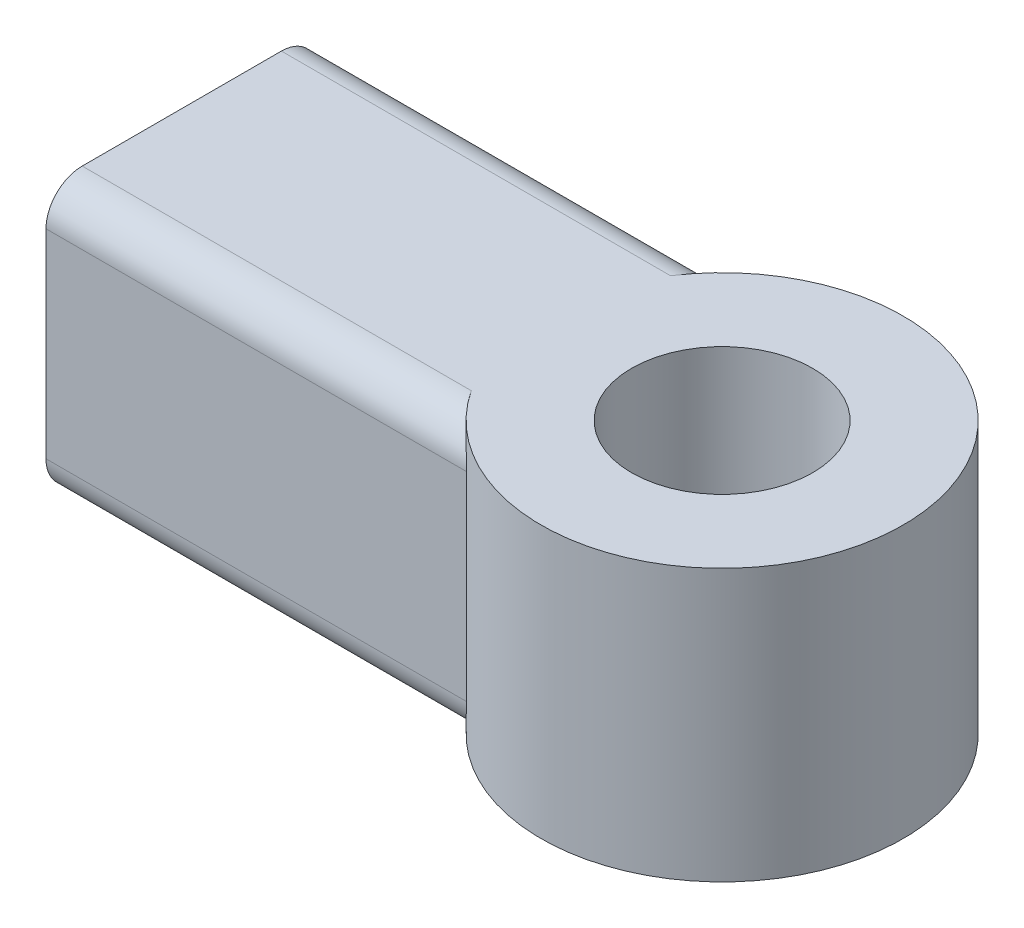
ISO-10303-21;
HEADER;
FILE_DESCRIPTION(('STEP AP214'),'2;1');
FILE_NAME('part.step','',(''),(''),'','','');
FILE_SCHEMA(('AUTOMOTIVE_DESIGN { 1 0 10303 214 1 1 1 1 }'));
ENDSEC;
DATA;
#1=APPLICATION_CONTEXT('core data for automotive mechanical design processes');
#2=APPLICATION_PROTOCOL_DEFINITION('international standard','automotive_design',2000,#1);
#3=PRODUCT_CONTEXT('',#1,'mechanical');
#4=PRODUCT('Part','Part','',(#3));
#5=PRODUCT_RELATED_PRODUCT_CATEGORY('part','',(#4));
#6=PRODUCT_DEFINITION_FORMATION('','',#4);
#7=PRODUCT_DEFINITION_CONTEXT('part definition',#1,'design');
#8=PRODUCT_DEFINITION('design','',#6,#7);
#9=PRODUCT_DEFINITION_SHAPE('','',#8);
#10=(LENGTH_UNIT() NAMED_UNIT(*) SI_UNIT(.MILLI.,.METRE.));
#11=(NAMED_UNIT(*) PLANE_ANGLE_UNIT() SI_UNIT($,.RADIAN.));
#12=(NAMED_UNIT(*) SI_UNIT($,.STERADIAN.) SOLID_ANGLE_UNIT());
#13=UNCERTAINTY_MEASURE_WITH_UNIT(LENGTH_MEASURE(1.E-05),#10,'distance_accuracy_value','');
#14=(GEOMETRIC_REPRESENTATION_CONTEXT(3) GLOBAL_UNCERTAINTY_ASSIGNED_CONTEXT((#13)) GLOBAL_UNIT_ASSIGNED_CONTEXT((#10,
#11,#12)) REPRESENTATION_CONTEXT('',''));
#15=CARTESIAN_POINT('',(0.,0.,0.));
#16=DIRECTION('',(0.,0.,1.));
#17=DIRECTION('',(1.,0.,0.));
#18=AXIS2_PLACEMENT_3D('',#15,#16,#17);
#19=CARTESIAN_POINT('',(0.,9.525,0.));
#20=DIRECTION('',(0.,1.,0.));
#21=DIRECTION('',(0.,0.,1.));
#22=AXIS2_PLACEMENT_3D('',#19,#20,#21);
#23=PLANE('',#22);
#24=CARTESIAN_POINT('',(0.,9.525,0.));
#25=DIRECTION('',(0.,1.,0.));
#26=DIRECTION('',(0.,0.,1.));
#27=AXIS2_PLACEMENT_3D('',#24,#25,#26);
#28=CIRCLE('',#27,6.35);
#29=CARTESIAN_POINT('',(-5.30329555559559,9.525,3.4925));
#30=VERTEX_POINT('',#29);
#31=CARTESIAN_POINT('',(-5.3032955555956,9.525,-3.4925));
#32=VERTEX_POINT('',#31);
#33=EDGE_CURVE('E121',#30,#32,#28,.T.);
#34=ORIENTED_EDGE('',*,*,#33,.T.);
#35=DIRECTION('',(-1.,0.,0.));
#36=VECTOR('',#35,1.);
#37=CARTESIAN_POINT('',(-18.9484589168103,9.525,-3.4925));
#38=LINE('',#37,#36);
#39=CARTESIAN_POINT('',(-18.9484589168103,9.525,-3.49249999999999));
#40=VERTEX_POINT('',#39);
#41=EDGE_CURVE('E106',#32,#40,#38,.T.);
#42=ORIENTED_EDGE('',*,*,#41,.T.);
#43=DIRECTION('',(0.,0.,1.));
#44=VECTOR('',#43,1.);
#45=CARTESIAN_POINT('',(-18.9484589168103,9.525,4.7625));
#46=LINE('',#45,#44);
#47=CARTESIAN_POINT('',(-18.9484589168103,9.525,3.4925));
#48=VERTEX_POINT('',#47);
#49=EDGE_CURVE('E119',#40,#48,#46,.T.);
#50=ORIENTED_EDGE('',*,*,#49,.T.);
#51=DIRECTION('',(1.,0.,0.));
#52=VECTOR('',#51,1.);
#53=CARTESIAN_POINT('',(-4.20013020631504,9.525,3.4925));
#54=LINE('',#53,#52);
#55=EDGE_CURVE('E124',#48,#30,#54,.T.);
#56=ORIENTED_EDGE('',*,*,#55,.T.);
#57=EDGE_LOOP('',(#34,#42,#50,#56));
#58=FACE_BOUND('',#57,.T.);
#59=CARTESIAN_POINT('',(0.,9.525,0.));
#60=DIRECTION('',(0.,1.,0.));
#61=DIRECTION('',(0.,0.,1.));
#62=AXIS2_PLACEMENT_3D('',#59,#60,#61);
#63=CIRCLE('',#62,3.175);
#64=CARTESIAN_POINT('',(0.,9.525,-3.175));
#65=VERTEX_POINT('',#64);
#66=EDGE_CURVE('E140',#65,#65,#63,.T.);
#67=ORIENTED_EDGE('',*,*,#66,.F.);
#68=EDGE_LOOP('',(#67));
#69=FACE_BOUND('',#68,.T.);
#70=ADVANCED_FACE('F32',(#58,#69),#23,.T.);
#71=CARTESIAN_POINT('',(0.,0.,0.));
#72=DIRECTION('',(0.,1.,0.));
#73=DIRECTION('',(0.,0.,1.));
#74=AXIS2_PLACEMENT_3D('',#71,#72,#73);
#75=PLANE('',#74);
#76=DIRECTION('',(0.,0.,1.));
#77=VECTOR('',#76,1.);
#78=CARTESIAN_POINT('',(-18.9484589168103,0.,4.7625));
#79=LINE('',#78,#77);
#80=CARTESIAN_POINT('',(-18.9484589168103,0.,-3.49249999999999));
#81=VERTEX_POINT('',#80);
#82=CARTESIAN_POINT('',(-18.9484589168103,0.,3.4925));
#83=VERTEX_POINT('',#82);
#84=EDGE_CURVE('E133',#81,#83,#79,.T.);
#85=ORIENTED_EDGE('',*,*,#84,.F.);
#86=DIRECTION('',(-1.,0.,0.));
#87=VECTOR('',#86,1.);
#88=CARTESIAN_POINT('',(0.,0.,-3.4925));
#89=LINE('',#88,#87);
#90=CARTESIAN_POINT('',(-5.3032955555956,0.,-3.4925));
#91=VERTEX_POINT('',#90);
#92=EDGE_CURVE('E161',#81,#91,#89,.F.);
#93=ORIENTED_EDGE('',*,*,#92,.T.);
#94=CARTESIAN_POINT('',(0.,0.,0.));
#95=DIRECTION('',(0.,1.,0.));
#96=DIRECTION('',(0.,0.,1.));
#97=AXIS2_PLACEMENT_3D('',#94,#95,#96);
#98=CIRCLE('',#97,6.35);
#99=CARTESIAN_POINT('',(-5.30329555559559,0.,3.4925));
#100=VERTEX_POINT('',#99);
#101=EDGE_CURVE('E129',#100,#91,#98,.T.);
#102=ORIENTED_EDGE('',*,*,#101,.F.);
#103=DIRECTION('',(1.,0.,0.));
#104=VECTOR('',#103,1.);
#105=CARTESIAN_POINT('',(0.,0.,3.4925));
#106=LINE('',#105,#104);
#107=EDGE_CURVE('E159',#100,#83,#106,.F.);
#108=ORIENTED_EDGE('',*,*,#107,.T.);
#109=EDGE_LOOP('',(#85,#93,#102,#108));
#110=FACE_BOUND('',#109,.T.);
#111=CARTESIAN_POINT('',(0.,0.,0.));
#112=DIRECTION('',(0.,1.,0.));
#113=DIRECTION('',(0.,0.,1.));
#114=AXIS2_PLACEMENT_3D('',#111,#112,#113);
#115=CIRCLE('',#114,3.175);
#116=CARTESIAN_POINT('',(0.,0.,-3.175));
#117=VERTEX_POINT('',#116);
#118=EDGE_CURVE('E136',#117,#117,#115,.T.);
#119=ORIENTED_EDGE('',*,*,#118,.T.);
#120=EDGE_LOOP('',(#119));
#121=FACE_BOUND('',#120,.T.);
#122=ADVANCED_FACE('F206',(#110,#121),#75,.F.);
#123=CARTESIAN_POINT('',(-18.9484589168103,9.525,4.7625));
#124=DIRECTION('',(1.,0.,0.));
#125=DIRECTION('',(0.,0.,-1.));
#126=AXIS2_PLACEMENT_3D('',#123,#124,#125);
#127=PLANE('',#126);
#128=CARTESIAN_POINT('',(-18.9484589168103,4.7625,0.));
#129=DIRECTION('',(-1.,0.,0.));
#130=DIRECTION('',(0.,0.,1.));
#131=AXIS2_PLACEMENT_3D('',#128,#129,#130);
#132=CIRCLE('',#131,3.175);
#133=CARTESIAN_POINT('',(-18.9484589168103,4.7625,3.175));
#134=VERTEX_POINT('',#133);
#135=EDGE_CURVE('E244',#134,#134,#132,.T.);
#136=ORIENTED_EDGE('',*,*,#135,.F.);
#137=EDGE_LOOP('',(#136));
#138=FACE_BOUND('',#137,.T.);
#139=ORIENTED_EDGE('',*,*,#49,.F.);
#140=CARTESIAN_POINT('',(-18.9484589168103,8.255,-3.4925));
#141=DIRECTION('',(1.,0.,0.));
#142=DIRECTION('',(0.,0.,-1.));
#143=AXIS2_PLACEMENT_3D('',#140,#141,#142);
#144=CIRCLE('',#143,1.27);
#145=CARTESIAN_POINT('',(-18.9484589168103,8.255,-4.7625));
#146=VERTEX_POINT('',#145);
#147=EDGE_CURVE('E102',#40,#146,#144,.F.);
#148=ORIENTED_EDGE('',*,*,#147,.T.);
#149=DIRECTION('',(0.,-1.,0.));
#150=VECTOR('',#149,1.);
#151=CARTESIAN_POINT('',(-18.9484589168103,9.525,-4.7625));
#152=LINE('',#151,#150);
#153=CARTESIAN_POINT('',(-18.9484589168103,1.27,-4.7625));
#154=VERTEX_POINT('',#153);
#155=EDGE_CURVE('E131',#146,#154,#152,.T.);
#156=ORIENTED_EDGE('',*,*,#155,.T.);
#157=CARTESIAN_POINT('',(-18.9484589168103,1.27,-3.4925));
#158=DIRECTION('',(1.,0.,0.));
#159=DIRECTION('',(0.,0.,-1.));
#160=AXIS2_PLACEMENT_3D('',#157,#158,#159);
#161=CIRCLE('',#160,1.27);
#162=EDGE_CURVE('E113',#154,#81,#161,.F.);
#163=ORIENTED_EDGE('',*,*,#162,.T.);
#164=ORIENTED_EDGE('',*,*,#84,.T.);
#165=CARTESIAN_POINT('',(-18.9484589168103,1.27,3.4925));
#166=DIRECTION('',(1.,0.,0.));
#167=DIRECTION('',(0.,0.,-1.));
#168=AXIS2_PLACEMENT_3D('',#165,#166,#167);
#169=CIRCLE('',#168,1.27);
#170=CARTESIAN_POINT('',(-18.9484589168103,1.27,4.7625));
#171=VERTEX_POINT('',#170);
#172=EDGE_CURVE('E153',#83,#171,#169,.F.);
#173=ORIENTED_EDGE('',*,*,#172,.T.);
#174=DIRECTION('',(0.,-1.,0.));
#175=VECTOR('',#174,1.);
#176=CARTESIAN_POINT('',(-18.9484589168103,9.525,4.7625));
#177=LINE('',#176,#175);
#178=CARTESIAN_POINT('',(-18.9484589168103,8.255,4.7625));
#179=VERTEX_POINT('',#178);
#180=EDGE_CURVE('E148',#179,#171,#177,.T.);
#181=ORIENTED_EDGE('',*,*,#180,.F.);
#182=CARTESIAN_POINT('',(-18.9484589168103,8.255,3.4925));
#183=DIRECTION('',(1.,0.,0.));
#184=DIRECTION('',(0.,0.,-1.));
#185=AXIS2_PLACEMENT_3D('',#182,#183,#184);
#186=CIRCLE('',#185,1.27);
#187=EDGE_CURVE('E123',#179,#48,#186,.F.);
#188=ORIENTED_EDGE('',*,*,#187,.T.);
#189=EDGE_LOOP('',(#139,#148,#156,#163,#164,#173,#181,#188));
#190=FACE_BOUND('',#189,.T.);
#191=ADVANCED_FACE('F126',(#138,#190),#127,.F.);
#192=CARTESIAN_POINT('',(-4.20013020631503,9.525,4.7625));
#193=DIRECTION('',(0.,0.,-1.));
#194=DIRECTION('',(-1.,0.,0.));
#195=AXIS2_PLACEMENT_3D('',#192,#193,#194);
#196=PLANE('',#195);
#197=ORIENTED_EDGE('',*,*,#180,.T.);
#198=DIRECTION('',(1.,0.,0.));
#199=VECTOR('',#198,1.);
#200=CARTESIAN_POINT('',(-4.20013020631503,1.27,4.7625));
#201=LINE('',#200,#199);
#202=CARTESIAN_POINT('',(-4.20013020631504,1.27,4.7625));
#203=VERTEX_POINT('',#202);
#204=EDGE_CURVE('E166',#171,#203,#201,.T.);
#205=ORIENTED_EDGE('',*,*,#204,.T.);
#206=DIRECTION('',(0.,-1.,0.));
#207=VECTOR('',#206,1.);
#208=CARTESIAN_POINT('',(-4.20013020631504,9.525,4.7625));
#209=LINE('',#208,#207);
#210=CARTESIAN_POINT('',(-4.20013020631504,8.255,4.7625));
#211=VERTEX_POINT('',#210);
#212=EDGE_CURVE('E146',#211,#203,#209,.T.);
#213=ORIENTED_EDGE('',*,*,#212,.F.);
#214=DIRECTION('',(1.,0.,0.));
#215=VECTOR('',#214,1.);
#216=CARTESIAN_POINT('',(-18.9484589168103,8.255,4.7625));
#217=LINE('',#216,#215);
#218=EDGE_CURVE('E164',#211,#179,#217,.F.);
#219=ORIENTED_EDGE('',*,*,#218,.T.);
#220=EDGE_LOOP('',(#197,#205,#213,#219));
#221=FACE_BOUND('',#220,.T.);
#222=ADVANCED_FACE('F209',(#221),#196,.F.);
#223=CARTESIAN_POINT('',(0.,9.525,0.));
#224=DIRECTION('',(0.,-1.,0.));
#225=DIRECTION('',(0.,0.,-1.));
#226=AXIS2_PLACEMENT_3D('',#223,#224,#225);
#227=CYLINDRICAL_SURFACE('',#226,6.35);
#228=ORIENTED_EDGE('',*,*,#101,.T.);
#229=CARTESIAN_POINT('',(-5.3032955555956,0.,-3.4925));
#230=CARTESIAN_POINT('',(-5.27359193249195,6.52779724683472E-06,-3.53761131289388));
#231=CARTESIAN_POINT('',(-5.2433300358599,0.0024031210133934,-3.58230215478618));
#232=CARTESIAN_POINT('',(-5.1819293551872,0.0117600977765963,-3.67055704957392));
#233=CARTESIAN_POINT('',(-5.15079106114589,0.0187179777538209,-3.71412170697569));
#234=CARTESIAN_POINT('',(-5.05631585226645,0.0461294320977427,-3.84284658267326));
#235=CARTESIAN_POINT('',(-4.99197115411557,0.0731200672262755,-3.92595817204894));
#236=CARTESIAN_POINT('',(-4.86437228131976,0.142395193622439,-4.08294297173452));
#237=CARTESIAN_POINT('',(-4.80112524013156,0.184330325758508,-4.15697914307488));
#238=CARTESIAN_POINT('',(-4.67673760869707,0.283140693042977,-4.29642939386015));
#239=CARTESIAN_POINT('',(-4.61559537576438,0.340003964209598,-4.36185031513027));
#240=CARTESIAN_POINT('',(-4.5160873071006,0.45013702328145,-4.46441413598644));
#241=CARTESIAN_POINT('',(-4.47627954829376,0.499617911746981,-4.50423958013182));
#242=CARTESIAN_POINT('',(-4.40151264689171,0.606499536232734,-4.57732448104472));
#243=CARTESIAN_POINT('',(-4.36654563221848,0.663887103653606,-4.61059463631039));
#244=CARTESIAN_POINT('',(-4.31195208159121,0.771315180896804,-4.66161015842651));
#245=CARTESIAN_POINT('',(-4.29067153991794,0.819650077811002,-4.68115951201044));
#246=CARTESIAN_POINT('',(-4.25396408636349,0.92027520778807,-4.71454173992361));
#247=CARTESIAN_POINT('',(-4.23851952498638,0.972552931979171,-4.72839186167922));
#248=CARTESIAN_POINT('',(-4.21810555648332,1.06570230577437,-4.74660173738453));
#249=CARTESIAN_POINT('',(-4.21144161153584,1.10590213629749,-4.75250683528842));
#250=CARTESIAN_POINT('',(-4.20241827555519,1.18737652366358,-4.76048225946277));
#251=CARTESIAN_POINT('',(-4.20008301274044,1.22865581167079,-4.76253109174983));
#252=CARTESIAN_POINT('',(-4.20013020631504,1.27,-4.7625));
#253=B_SPLINE_CURVE_WITH_KNOTS('',3,(#229,#230,#231,#232,#233,#234,#235,#236,#237,#238,#239,
#240,#241,#242,#243,#244,#245,#246,#247,#248,#249,#250,#251,#252),.UNSPECIFIED.,.F.,.F.,(4,2,2,
2,2,2,2,2,2,2,2,4),(0.,0.161902356459137,0.323715923309768,0.647625221059924,0.964411839025793,
1.28094534304759,1.50516008717384,1.72900581624811,1.89735775626463,2.0651964026532,
2.18831975579654,2.31212736244025),.UNSPECIFIED.);
#254=CARTESIAN_POINT('',(-4.20013020631504,1.27,-4.7625));
#255=VERTEX_POINT('',#254);
#256=EDGE_CURVE('E174',#91,#255,#253,.T.);
#257=ORIENTED_EDGE('',*,*,#256,.T.);
#258=DIRECTION('',(0.,-1.,0.));
#259=VECTOR('',#258,1.);
#260=CARTESIAN_POINT('',(-4.20013020631504,9.525,-4.7625));
#261=LINE('',#260,#259);
#262=CARTESIAN_POINT('',(-4.20013020631504,8.255,-4.7625));
#263=VERTEX_POINT('',#262);
#264=EDGE_CURVE('E143',#263,#255,#261,.T.);
#265=ORIENTED_EDGE('',*,*,#264,.F.);
#266=CARTESIAN_POINT('',(-4.20013020631504,8.255,-4.7625));
#267=CARTESIAN_POINT('',(-4.20012211862867,8.28319785483389,-4.76250498307731));
#268=CARTESIAN_POINT('',(-4.20119609372336,8.31137550999857,-4.76156012317124));
#269=CARTESIAN_POINT('',(-4.20542639442946,8.36741626064644,-4.75782527470246));
#270=CARTESIAN_POINT('',(-4.20858010520386,8.39527970649762,-4.75503760308325));
#271=CARTESIAN_POINT('',(-4.22094136740364,8.47742174750408,-4.74407816756563));
#272=CARTESIAN_POINT('',(-4.23305335706444,8.53095026530805,-4.73330697693976));
#273=CARTESIAN_POINT('',(-4.26364497116893,8.63412288476029,-4.70576700420154));
#274=CARTESIAN_POINT('',(-4.28209497104659,8.68378376244424,-4.68902611153109));
#275=CARTESIAN_POINT('',(-4.32391883699333,8.77903452804365,-4.6504881350644));
#276=CARTESIAN_POINT('',(-4.34730854948043,8.82461062527084,-4.62867475558511));
#277=CARTESIAN_POINT('',(-4.41097211549499,8.93431702661454,-4.56821817893938));
#278=CARTESIAN_POINT('',(-4.45363393105488,8.99551468053802,-4.52677497333755));
#279=CARTESIAN_POINT('',(-4.54380261922865,9.10789263270936,-4.43626779441584));
#280=CARTESIAN_POINT('',(-4.59132039037033,9.1590496103288,-4.38718654360686));
#281=CARTESIAN_POINT('',(-4.70235483894877,9.26441415323173,-4.26833064544724));
#282=CARTESIAN_POINT('',(-4.76666682285152,9.31556507801929,-4.19658385814883));
#283=CARTESIAN_POINT('',(-4.89606437594231,9.40190269267573,-4.0448738860203));
#284=CARTESIAN_POINT('',(-4.96114913889675,9.43710473748004,-3.96491869528944));
#285=CARTESIAN_POINT('',(-5.07319841721331,9.48380368403804,-3.81984915855057));
#286=CARTESIAN_POINT('',(-5.12051749977457,9.49906904474297,-3.75620775802863));
#287=CARTESIAN_POINT('',(-5.2134114910215,9.51964952603686,-3.62619777614188));
#288=CARTESIAN_POINT('',(-5.25898775831201,9.52497255868023,-3.55983140631784));
#289=CARTESIAN_POINT('',(-5.3032955555956,9.525,-3.49249999999999));
#290=B_SPLINE_CURVE_WITH_KNOTS('',3,(#266,#267,#268,#269,#270,#271,#272,#273,#274,#275,#276,
#277,#278,#279,#280,#281,#282,#283,#284,#285,#286,#287,#288,#289),.UNSPECIFIED.,.F.,.F.,(4,2,2,
2,2,2,2,2,2,2,2,4),(0.,0.0845201171612266,0.168934169861919,0.335703775929661,0.50170425586777,
0.668245575759364,0.92285223928473,1.17804343444812,1.50368430417439,1.82901099035876,
2.07065340989457,2.31210344954862),.UNSPECIFIED.);
#291=EDGE_CURVE('E168',#263,#32,#290,.T.);
#292=ORIENTED_EDGE('',*,*,#291,.T.);
#293=ORIENTED_EDGE('',*,*,#33,.F.);
#294=CARTESIAN_POINT('',(-5.30329555559559,9.525,3.4925));
#295=CARTESIAN_POINT('',(-5.27359193249195,9.52499347220275,3.53761131289389));
#296=CARTESIAN_POINT('',(-5.24333003585989,9.5225968789866,3.58230215478619));
#297=CARTESIAN_POINT('',(-5.18192935518719,9.5132399022234,3.67055704957393));
#298=CARTESIAN_POINT('',(-5.15079106114589,9.50628202224618,3.7141217069757));
#299=CARTESIAN_POINT('',(-5.05631585226644,9.47887056790226,3.84284658267327));
#300=CARTESIAN_POINT('',(-4.99197115411557,9.45187993277373,3.92595817204895));
#301=CARTESIAN_POINT('',(-4.86437228131976,9.38260480637756,4.08294297173453));
#302=CARTESIAN_POINT('',(-4.80112524013155,9.34066967424149,4.15697914307488));
#303=CARTESIAN_POINT('',(-4.67673760869707,9.24185930695702,4.29642939386015));
#304=CARTESIAN_POINT('',(-4.61559537576437,9.18499603579041,4.36185031513028));
#305=CARTESIAN_POINT('',(-4.51608730710059,9.07486297671855,4.46441413598645));
#306=CARTESIAN_POINT('',(-4.47627954829376,9.02538208825302,4.50423958013183));
#307=CARTESIAN_POINT('',(-4.4015126468917,8.91850046376726,4.57732448104472));
#308=CARTESIAN_POINT('',(-4.36654563221847,8.86111289634639,4.6105946363104));
#309=CARTESIAN_POINT('',(-4.3119520815912,8.7536848191032,4.66161015842652));
#310=CARTESIAN_POINT('',(-4.29067153991793,8.705349922189,4.68115951201045));
#311=CARTESIAN_POINT('',(-4.25396408636348,8.60472479221193,4.71454173992362));
#312=CARTESIAN_POINT('',(-4.23851952498637,8.55244706802083,4.72839186167923));
#313=CARTESIAN_POINT('',(-4.21810555648331,8.45929769422563,4.74660173738454));
#314=CARTESIAN_POINT('',(-4.21144161153584,8.41909786370251,4.75250683528843));
#315=CARTESIAN_POINT('',(-4.20241827555519,8.33762347633641,4.76048225946278));
#316=CARTESIAN_POINT('',(-4.20008301274044,8.29634418832921,4.76253109174983));
#317=CARTESIAN_POINT('',(-4.20013020631503,8.255,4.7625));
#318=B_SPLINE_CURVE_WITH_KNOTS('',3,(#294,#295,#296,#297,#298,#299,#300,#301,#302,#303,#304,
#305,#306,#307,#308,#309,#310,#311,#312,#313,#314,#315,#316,#317),.UNSPECIFIED.,.F.,.F.,(4,2,2,
2,2,2,2,2,2,2,2,4),(0.,0.161902356459137,0.323715923309767,0.647625221059924,0.964411839025793,
1.28094534304759,1.50516008717384,1.72900581624812,1.89735775626464,2.0651964026532,
2.18831975579655,2.31212736244025),.UNSPECIFIED.);
#319=EDGE_CURVE('E11',#30,#211,#318,.T.);
#320=ORIENTED_EDGE('',*,*,#319,.T.);
#321=ORIENTED_EDGE('',*,*,#212,.T.);
#322=CARTESIAN_POINT('',(-4.20013020631504,1.27,4.7625));
#323=CARTESIAN_POINT('',(-4.20012211862867,1.24180214516611,4.76250498307732));
#324=CARTESIAN_POINT('',(-4.20119609372335,1.21362449000143,4.76156012317125));
#325=CARTESIAN_POINT('',(-4.20542639442945,1.15758373935356,4.75782527470247));
#326=CARTESIAN_POINT('',(-4.20858010520385,1.12972029350238,4.75503760308326));
#327=CARTESIAN_POINT('',(-4.22094136740364,1.04757825249592,4.74407816756563));
#328=CARTESIAN_POINT('',(-4.23305335706443,0.994049734691952,4.73330697693976));
#329=CARTESIAN_POINT('',(-4.26364497116893,0.890877115239714,4.70576700420155));
#330=CARTESIAN_POINT('',(-4.28209497104658,0.841216237555765,4.6890261115311));
#331=CARTESIAN_POINT('',(-4.32391883699333,0.745965471956347,4.65048813506441));
#332=CARTESIAN_POINT('',(-4.34730854948042,0.700389374729162,4.62867475558512));
#333=CARTESIAN_POINT('',(-4.41097211549498,0.590682973385458,4.56821817893938));
#334=CARTESIAN_POINT('',(-4.45363393105487,0.529485319461981,4.52677497333756));
#335=CARTESIAN_POINT('',(-4.54380261922864,0.417107367290639,4.43626779441585));
#336=CARTESIAN_POINT('',(-4.59132039037033,0.365950389671198,4.38718654360686));
#337=CARTESIAN_POINT('',(-4.70235483894877,0.26058584676827,4.26833064544725));
#338=CARTESIAN_POINT('',(-4.76666682285152,0.209434921980713,4.19658385814883));
#339=CARTESIAN_POINT('',(-4.89606437594231,0.12309730732427,4.04487388602031));
#340=CARTESIAN_POINT('',(-4.96114913889674,0.0878952625199641,3.96491869528944));
#341=CARTESIAN_POINT('',(-5.07319841721331,0.0411963159619564,3.81984915855057));
#342=CARTESIAN_POINT('',(-5.12051749977457,0.0259309552570268,3.75620775802864));
#343=CARTESIAN_POINT('',(-5.2134114910215,0.00535047396313926,3.62619777614189));
#344=CARTESIAN_POINT('',(-5.25898775831201,2.74413197752903E-05,3.55983140631785));
#345=CARTESIAN_POINT('',(-5.30329555559559,0.,3.4925));
#346=B_SPLINE_CURVE_WITH_KNOTS('',3,(#322,#323,#324,#325,#326,#327,#328,#329,#330,#331,#332,
#333,#334,#335,#336,#337,#338,#339,#340,#341,#342,#343,#344,#345),.UNSPECIFIED.,.F.,.F.,(4,2,2,
2,2,2,2,2,2,2,2,4),(0.,0.0845201171612263,0.168934169861919,0.335703775929661,0.50170425586777,
0.668245575759363,0.922852239284729,1.17804343444812,1.50368430417439,1.82901099035876,
2.07065340989457,2.31210344954862),.UNSPECIFIED.);
#347=EDGE_CURVE('E45',#203,#100,#346,.T.);
#348=ORIENTED_EDGE('',*,*,#347,.T.);
#349=EDGE_LOOP('',(#228,#257,#265,#292,#293,#320,#321,#348));
#350=FACE_BOUND('',#349,.T.);
#351=ADVANCED_FACE('F179',(#350),#227,.T.);
#352=CARTESIAN_POINT('',(-4.20013020631504,9.525,-4.7625));
#353=DIRECTION('',(0.,0.,1.));
#354=DIRECTION('',(1.,0.,0.));
#355=AXIS2_PLACEMENT_3D('',#352,#353,#354);
#356=PLANE('',#355);
#357=ORIENTED_EDGE('',*,*,#155,.F.);
#358=DIRECTION('',(-1.,0.,0.));
#359=VECTOR('',#358,1.);
#360=CARTESIAN_POINT('',(-4.20013020631504,8.255,-4.7625));
#361=LINE('',#360,#359);
#362=EDGE_CURVE('E107',#146,#263,#361,.F.);
#363=ORIENTED_EDGE('',*,*,#362,.T.);
#364=ORIENTED_EDGE('',*,*,#264,.T.);
#365=DIRECTION('',(-1.,0.,0.));
#366=VECTOR('',#365,1.);
#367=CARTESIAN_POINT('',(-4.20013020631504,1.27,-4.7625));
#368=LINE('',#367,#366);
#369=EDGE_CURVE('E112',#255,#154,#368,.T.);
#370=ORIENTED_EDGE('',*,*,#369,.T.);
#371=EDGE_LOOP('',(#357,#363,#364,#370));
#372=FACE_BOUND('',#371,.T.);
#373=ADVANCED_FACE('F202',(#372),#356,.F.);
#374=CARTESIAN_POINT('',(0.,9.525,0.));
#375=DIRECTION('',(0.,-1.,0.));
#376=DIRECTION('',(0.,0.,-1.));
#377=AXIS2_PLACEMENT_3D('',#374,#375,#376);
#378=CYLINDRICAL_SURFACE('',#377,3.175);
#379=CARTESIAN_POINT('',(0.,9.525,-3.175));
#380=CARTESIAN_POINT('',(0.,9.42578125,-3.175));
#381=CARTESIAN_POINT('',(0.,9.3265625,-3.175));
#382=CARTESIAN_POINT('',(0.,9.128125,-3.175));
#383=CARTESIAN_POINT('',(0.,9.02890625,-3.175));
#384=CARTESIAN_POINT('',(0.,8.83046875,-3.175));
#385=CARTESIAN_POINT('',(0.,8.73125,-3.175));
#386=CARTESIAN_POINT('',(0.,8.5328125,-3.175));
#387=CARTESIAN_POINT('',(0.,8.43359375,-3.175));
#388=CARTESIAN_POINT('',(0.,8.23515625,-3.175));
#389=CARTESIAN_POINT('',(0.,8.1359375,-3.175));
#390=CARTESIAN_POINT('',(0.,7.9375,-3.175));
#391=CARTESIAN_POINT('',(0.,7.83828125,-3.175));
#392=CARTESIAN_POINT('',(0.,7.63984375,-3.175));
#393=CARTESIAN_POINT('',(0.,7.540625,-3.175));
#394=CARTESIAN_POINT('',(0.,7.3421875,-3.175));
#395=CARTESIAN_POINT('',(0.,7.24296875,-3.175));
#396=CARTESIAN_POINT('',(0.,7.04453125,-3.175));
#397=CARTESIAN_POINT('',(0.,6.9453125,-3.175));
#398=CARTESIAN_POINT('',(0.,6.746875,-3.175));
#399=CARTESIAN_POINT('',(0.,6.64765625,-3.175));
#400=CARTESIAN_POINT('',(0.,6.44921875,-3.175));
#401=CARTESIAN_POINT('',(0.,6.35,-3.175));
#402=CARTESIAN_POINT('',(0.,6.1515625,-3.175));
#403=CARTESIAN_POINT('',(0.,6.05234375,-3.175));
#404=CARTESIAN_POINT('',(0.,5.85390625,-3.175));
#405=CARTESIAN_POINT('',(0.,5.7546875,-3.175));
#406=CARTESIAN_POINT('',(0.,5.55625,-3.175));
#407=CARTESIAN_POINT('',(0.,5.45703125,-3.175));
#408=CARTESIAN_POINT('',(0.,5.25859375,-3.175));
#409=CARTESIAN_POINT('',(0.,5.159375,-3.175));
#410=CARTESIAN_POINT('',(0.,4.9609375,-3.175));
#411=CARTESIAN_POINT('',(0.,4.86171875,-3.175));
#412=CARTESIAN_POINT('',(0.,4.66328125,-3.175));
#413=CARTESIAN_POINT('',(0.,4.5640625,-3.175));
#414=CARTESIAN_POINT('',(0.,4.365625,-3.175));
#415=CARTESIAN_POINT('',(0.,4.26640625,-3.175));
#416=CARTESIAN_POINT('',(0.,4.06796875,-3.175));
#417=CARTESIAN_POINT('',(0.,3.96875,-3.175));
#418=CARTESIAN_POINT('',(0.,3.7703125,-3.175));
#419=CARTESIAN_POINT('',(0.,3.67109375,-3.175));
#420=CARTESIAN_POINT('',(0.,3.47265625,-3.175));
#421=CARTESIAN_POINT('',(0.,3.3734375,-3.175));
#422=CARTESIAN_POINT('',(0.,3.175,-3.175));
#423=CARTESIAN_POINT('',(0.,3.07578125,-3.175));
#424=CARTESIAN_POINT('',(0.,2.87734375,-3.175));
#425=CARTESIAN_POINT('',(0.,2.778125,-3.175));
#426=CARTESIAN_POINT('',(0.,2.5796875,-3.175));
#427=CARTESIAN_POINT('',(0.,2.48046875,-3.175));
#428=CARTESIAN_POINT('',(0.,2.28203125,-3.175));
#429=CARTESIAN_POINT('',(0.,2.1828125,-3.175));
#430=CARTESIAN_POINT('',(0.,1.984375,-3.175));
#431=CARTESIAN_POINT('',(0.,1.88515625,-3.175));
#432=CARTESIAN_POINT('',(0.,1.68671875,-3.175));
#433=CARTESIAN_POINT('',(0.,1.5875,-3.175));
#434=CARTESIAN_POINT('',(0.,1.3890625,-3.175));
#435=CARTESIAN_POINT('',(0.,1.28984375,-3.175));
#436=CARTESIAN_POINT('',(0.,1.09140625,-3.175));
#437=CARTESIAN_POINT('',(0.,0.992187500000001,-3.175));
#438=CARTESIAN_POINT('',(0.,0.793750000000001,-3.175));
#439=CARTESIAN_POINT('',(0.,0.69453125,-3.175));
#440=CARTESIAN_POINT('',(0.,0.49609375,-3.175));
#441=CARTESIAN_POINT('',(0.,0.396875,-3.175));
#442=CARTESIAN_POINT('',(0.,0.1984375,-3.175));
#443=CARTESIAN_POINT('',(0.,0.0992187500000001,-3.175));
#444=CARTESIAN_POINT('',(0.,0.,-3.175));
#445=B_SPLINE_CURVE_WITH_KNOTS('',3,(#379,#380,#381,#382,#383,#384,#385,#386,#387,#388,#389,
#390,#391,#392,#393,#394,#395,#396,#397,#398,#399,#400,#401,#402,#403,#404,#405,#406,#407,#408,
#409,#410,#411,#412,#413,#414,#415,#416,#417,#418,#419,#420,#421,#422,#423,#424,#425,#426,#427,
#428,#429,#430,#431,#432,#433,#434,#435,#436,#437,#438,#439,#440,#441,#442,#443,#444),
.UNSPECIFIED.,.F.,.F.,(4,2,2,2,2,2,2,2,2,2,2,2,2,2,2,2,2,2,2,2,2,2,2,2,2,2,2,2,2,2,2,2,4),(0.,
0.29765625,0.5953125,0.892968750000001,1.190625,1.48828125,1.7859375,2.08359375,2.38125,
2.67890625,2.9765625,3.27421875,3.571875,3.86953125,4.1671875,4.46484375,4.7625,5.06015625,
5.3578125,5.65546875,5.953125,6.25078125,6.5484375,6.84609375,7.14375,7.44140625,7.7390625,
8.03671875,8.334375,8.63203125,8.9296875,9.22734375,9.525),.UNSPECIFIED.);
#446=EDGE_CURVE('BSEAM187',#65,#117,#445,.T.);
#447=ORIENTED_EDGE('',*,*,#66,.T.);
#448=ORIENTED_EDGE('',*,*,#118,.F.);
#449=ORIENTED_EDGE('',*,*,#446,.T.);
#450=ORIENTED_EDGE('',*,*,#446,.F.);
#451=EDGE_LOOP('',(#447,#449,#448,#450));
#452=FACE_BOUND('',#451,.T.);
#453=ADVANCED_FACE('F187',(#452),#378,.F.);
#454=CARTESIAN_POINT('',(0.,8.255,-3.4925));
#455=DIRECTION('',(1.,0.,0.));
#456=DIRECTION('',(0.,0.,-1.));
#457=AXIS2_PLACEMENT_3D('',#454,#455,#456);
#458=CYLINDRICAL_SURFACE('',#457,1.27);
#459=ORIENTED_EDGE('',*,*,#291,.F.);
#460=ORIENTED_EDGE('',*,*,#362,.F.);
#461=ORIENTED_EDGE('',*,*,#147,.F.);
#462=ORIENTED_EDGE('',*,*,#41,.F.);
#463=EDGE_LOOP('',(#459,#460,#461,#462));
#464=FACE_BOUND('',#463,.T.);
#465=ADVANCED_FACE('F105',(#464),#458,.T.);
#466=CARTESIAN_POINT('',(-4.20013020631504,1.27,-3.4925));
#467=DIRECTION('',(-1.,0.,0.));
#468=DIRECTION('',(0.,0.,1.));
#469=AXIS2_PLACEMENT_3D('',#466,#467,#468);
#470=CYLINDRICAL_SURFACE('',#469,1.27);
#471=ORIENTED_EDGE('',*,*,#256,.F.);
#472=ORIENTED_EDGE('',*,*,#92,.F.);
#473=ORIENTED_EDGE('',*,*,#162,.F.);
#474=ORIENTED_EDGE('',*,*,#369,.F.);
#475=EDGE_LOOP('',(#471,#472,#473,#474));
#476=FACE_BOUND('',#475,.T.);
#477=ADVANCED_FACE('F186',(#476),#470,.T.);
#478=CARTESIAN_POINT('',(-4.20013020631503,1.27,3.4925));
#479=DIRECTION('',(1.,0.,0.));
#480=DIRECTION('',(0.,0.,-1.));
#481=AXIS2_PLACEMENT_3D('',#478,#479,#480);
#482=CYLINDRICAL_SURFACE('',#481,1.27);
#483=ORIENTED_EDGE('',*,*,#172,.F.);
#484=ORIENTED_EDGE('',*,*,#107,.F.);
#485=ORIENTED_EDGE('',*,*,#347,.F.);
#486=ORIENTED_EDGE('',*,*,#204,.F.);
#487=EDGE_LOOP('',(#483,#484,#485,#486));
#488=FACE_BOUND('',#487,.T.);
#489=ADVANCED_FACE('F190',(#488),#482,.T.);
#490=CARTESIAN_POINT('',(0.,8.255,3.4925));
#491=DIRECTION('',(-1.,0.,0.));
#492=DIRECTION('',(0.,0.,1.));
#493=AXIS2_PLACEMENT_3D('',#490,#491,#492);
#494=CYLINDRICAL_SURFACE('',#493,1.27);
#495=ORIENTED_EDGE('',*,*,#187,.F.);
#496=ORIENTED_EDGE('',*,*,#218,.F.);
#497=ORIENTED_EDGE('',*,*,#319,.F.);
#498=ORIENTED_EDGE('',*,*,#55,.F.);
#499=EDGE_LOOP('',(#495,#496,#497,#498));
#500=FACE_BOUND('',#499,.T.);
#501=ADVANCED_FACE('F34',(#500),#494,.T.);
#502=CARTESIAN_POINT('',(-6.24845891681029,4.7625,0.));
#503=DIRECTION('',(-1.,0.,0.));
#504=DIRECTION('',(0.,0.,1.));
#505=AXIS2_PLACEMENT_3D('',#502,#503,#504);
#506=CYLINDRICAL_SURFACE('',#505,3.175);
#507=CARTESIAN_POINT('',(-6.24845891681029,4.7625,0.));
#508=DIRECTION('',(-1.,0.,0.));
#509=DIRECTION('',(0.,0.,1.));
#510=AXIS2_PLACEMENT_3D('',#507,#508,#509);
#511=CIRCLE('',#510,3.175);
#512=CARTESIAN_POINT('',(-6.24845891681029,4.7625,3.175));
#513=VERTEX_POINT('',#512);
#514=EDGE_CURVE('E246',#513,#513,#511,.T.);
#515=ORIENTED_EDGE('',*,*,#514,.F.);
#516=EDGE_LOOP('',(#515));
#517=FACE_BOUND('',#516,.T.);
#518=ORIENTED_EDGE('',*,*,#135,.T.);
#519=EDGE_LOOP('',(#518));
#520=FACE_BOUND('',#519,.T.);
#521=ADVANCED_FACE('F213',(#517,#520),#506,.F.);
#522=CARTESIAN_POINT('',(-6.24845891681029,4.7625,0.));
#523=DIRECTION('',(-1.,0.,0.));
#524=DIRECTION('',(0.,0.,1.));
#525=AXIS2_PLACEMENT_3D('',#522,#523,#524);
#526=PLANE('',#525);
#527=ORIENTED_EDGE('',*,*,#514,.T.);
#528=EDGE_LOOP('',(#527));
#529=FACE_BOUND('',#528,.T.);
#530=ADVANCED_FACE('F217',(#529),#526,.T.);
#531=CLOSED_SHELL('',(#70,#122,#191,#222,#351,#373,#453,#465,#477,#489,#501,#521,#530));
#532=MANIFOLD_SOLID_BREP('B2',#531);
#533=ADVANCED_BREP_SHAPE_REPRESENTATION('',(#18,#532),#14);
#534=SHAPE_DEFINITION_REPRESENTATION(#9,#533);
ENDSEC;
END-ISO-10303-21;
